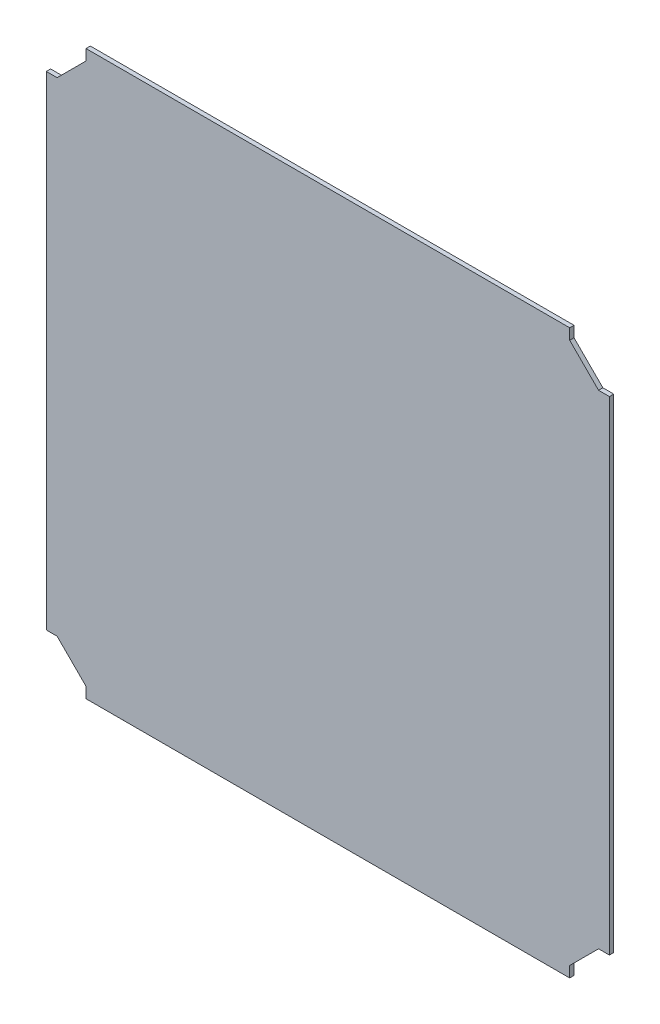
ISO-10303-21;
HEADER;
FILE_DESCRIPTION(('STEP AP214'),'2;1');
FILE_NAME('part.step','',(''),(''),'','','');
FILE_SCHEMA(('AUTOMOTIVE_DESIGN { 1 0 10303 214 1 1 1 1 }'));
ENDSEC;
DATA;
#1=APPLICATION_CONTEXT('core data for automotive mechanical design processes');
#2=APPLICATION_PROTOCOL_DEFINITION('international standard','automotive_design',2000,#1);
#3=PRODUCT_CONTEXT('',#1,'mechanical');
#4=PRODUCT('Part','Part','',(#3));
#5=PRODUCT_RELATED_PRODUCT_CATEGORY('part','',(#4));
#6=PRODUCT_DEFINITION_FORMATION('','',#4);
#7=PRODUCT_DEFINITION_CONTEXT('part definition',#1,'design');
#8=PRODUCT_DEFINITION('design','',#6,#7);
#9=PRODUCT_DEFINITION_SHAPE('','',#8);
#10=(LENGTH_UNIT() NAMED_UNIT(*) SI_UNIT(.MILLI.,.METRE.));
#11=(NAMED_UNIT(*) PLANE_ANGLE_UNIT() SI_UNIT($,.RADIAN.));
#12=(NAMED_UNIT(*) SI_UNIT($,.STERADIAN.) SOLID_ANGLE_UNIT());
#13=UNCERTAINTY_MEASURE_WITH_UNIT(LENGTH_MEASURE(1.E-05),#10,'distance_accuracy_value','');
#14=(GEOMETRIC_REPRESENTATION_CONTEXT(3) GLOBAL_UNCERTAINTY_ASSIGNED_CONTEXT((#13)) GLOBAL_UNIT_ASSIGNED_CONTEXT((#10,
#11,#12)) REPRESENTATION_CONTEXT('',''));
#15=CARTESIAN_POINT('',(0.,0.,0.));
#16=DIRECTION('',(0.,0.,1.));
#17=DIRECTION('',(1.,0.,0.));
#18=AXIS2_PLACEMENT_3D('',#15,#16,#17);
#19=CARTESIAN_POINT('',(-390.,-390.,6.));
#20=DIRECTION('',(1.,0.,0.));
#21=DIRECTION('',(0.,0.,-1.));
#22=AXIS2_PLACEMENT_3D('',#19,#20,#21);
#23=PLANE('',#22);
#24=DIRECTION('',(0.,-1.,0.));
#25=VECTOR('',#24,1.);
#26=CARTESIAN_POINT('',(-390.,-390.,0.));
#27=LINE('',#26,#25);
#28=CARTESIAN_POINT('',(-390.,335.,0.));
#29=VERTEX_POINT('',#28);
#30=CARTESIAN_POINT('',(-390.,-335.,0.));
#31=VERTEX_POINT('',#30);
#32=EDGE_CURVE('E262',#29,#31,#27,.T.);
#33=ORIENTED_EDGE('',*,*,#32,.T.);
#34=DIRECTION('',(0.,0.,1.));
#35=VECTOR('',#34,1.);
#36=CARTESIAN_POINT('',(-390.,-335.,0.));
#37=LINE('',#36,#35);
#38=CARTESIAN_POINT('',(-390.,-335.,6.));
#39=VERTEX_POINT('',#38);
#40=EDGE_CURVE('E230',#31,#39,#37,.T.);
#41=ORIENTED_EDGE('',*,*,#40,.T.);
#42=DIRECTION('',(0.,-1.,0.));
#43=VECTOR('',#42,1.);
#44=CARTESIAN_POINT('',(-390.,-390.,6.));
#45=LINE('',#44,#43);
#46=CARTESIAN_POINT('',(-390.,335.,6.));
#47=VERTEX_POINT('',#46);
#48=EDGE_CURVE('E176',#47,#39,#45,.T.);
#49=ORIENTED_EDGE('',*,*,#48,.F.);
#50=DIRECTION('',(0.,0.,1.));
#51=VECTOR('',#50,1.);
#52=CARTESIAN_POINT('',(-390.,335.,0.));
#53=LINE('',#52,#51);
#54=EDGE_CURVE('E256',#29,#47,#53,.T.);
#55=ORIENTED_EDGE('',*,*,#54,.F.);
#56=EDGE_LOOP('',(#33,#41,#49,#55));
#57=FACE_BOUND('',#56,.T.);
#58=ADVANCED_FACE('F35',(#57),#23,.F.);
#59=CARTESIAN_POINT('',(390.,-390.,6.));
#60=DIRECTION('',(0.,1.,0.));
#61=DIRECTION('',(-1.,0.,0.));
#62=AXIS2_PLACEMENT_3D('',#59,#60,#61);
#63=PLANE('',#62);
#64=DIRECTION('',(1.,0.,0.));
#65=VECTOR('',#64,1.);
#66=CARTESIAN_POINT('',(390.,-390.,6.));
#67=LINE('',#66,#65);
#68=CARTESIAN_POINT('',(-335.,-390.,6.));
#69=VERTEX_POINT('',#68);
#70=CARTESIAN_POINT('',(335.,-390.,6.));
#71=VERTEX_POINT('',#70);
#72=EDGE_CURVE('E180',#69,#71,#67,.T.);
#73=ORIENTED_EDGE('',*,*,#72,.F.);
#74=DIRECTION('',(0.,0.,1.));
#75=VECTOR('',#74,1.);
#76=CARTESIAN_POINT('',(-335.,-390.,0.));
#77=LINE('',#76,#75);
#78=CARTESIAN_POINT('',(-335.,-390.,0.));
#79=VERTEX_POINT('',#78);
#80=EDGE_CURVE('E232',#79,#69,#77,.T.);
#81=ORIENTED_EDGE('',*,*,#80,.F.);
#82=DIRECTION('',(1.,0.,0.));
#83=VECTOR('',#82,1.);
#84=CARTESIAN_POINT('',(390.,-390.,0.));
#85=LINE('',#84,#83);
#86=CARTESIAN_POINT('',(335.,-390.,0.));
#87=VERTEX_POINT('',#86);
#88=EDGE_CURVE('E183',#79,#87,#85,.T.);
#89=ORIENTED_EDGE('',*,*,#88,.T.);
#90=DIRECTION('',(0.,0.,1.));
#91=VECTOR('',#90,1.);
#92=CARTESIAN_POINT('',(335.,-390.,0.));
#93=LINE('',#92,#91);
#94=EDGE_CURVE('E274',#87,#71,#93,.T.);
#95=ORIENTED_EDGE('',*,*,#94,.T.);
#96=EDGE_LOOP('',(#73,#81,#89,#95));
#97=FACE_BOUND('',#96,.T.);
#98=ADVANCED_FACE('F272',(#97),#63,.F.);
#99=CARTESIAN_POINT('',(390.,-390.,6.));
#100=DIRECTION('',(-1.,0.,0.));
#101=DIRECTION('',(0.,0.,1.));
#102=AXIS2_PLACEMENT_3D('',#99,#100,#101);
#103=PLANE('',#102);
#104=DIRECTION('',(0.,1.,0.));
#105=VECTOR('',#104,1.);
#106=CARTESIAN_POINT('',(390.,-390.,6.));
#107=LINE('',#106,#105);
#108=CARTESIAN_POINT('',(390.,-335.,6.));
#109=VERTEX_POINT('',#108);
#110=CARTESIAN_POINT('',(390.,335.,6.));
#111=VERTEX_POINT('',#110);
#112=EDGE_CURVE('E265',#109,#111,#107,.T.);
#113=ORIENTED_EDGE('',*,*,#112,.F.);
#114=DIRECTION('',(0.,0.,1.));
#115=VECTOR('',#114,1.);
#116=CARTESIAN_POINT('',(390.,-335.,0.));
#117=LINE('',#116,#115);
#118=CARTESIAN_POINT('',(390.,-335.,0.));
#119=VERTEX_POINT('',#118);
#120=EDGE_CURVE('E281',#119,#109,#117,.T.);
#121=ORIENTED_EDGE('',*,*,#120,.F.);
#122=DIRECTION('',(0.,1.,0.));
#123=VECTOR('',#122,1.);
#124=CARTESIAN_POINT('',(390.,-390.,0.));
#125=LINE('',#124,#123);
#126=CARTESIAN_POINT('',(390.,335.,0.));
#127=VERTEX_POINT('',#126);
#128=EDGE_CURVE('E177',#119,#127,#125,.T.);
#129=ORIENTED_EDGE('',*,*,#128,.T.);
#130=DIRECTION('',(0.,0.,1.));
#131=VECTOR('',#130,1.);
#132=CARTESIAN_POINT('',(390.,335.,0.));
#133=LINE('',#132,#131);
#134=EDGE_CURVE('E169',#127,#111,#133,.T.);
#135=ORIENTED_EDGE('',*,*,#134,.T.);
#136=EDGE_LOOP('',(#113,#121,#129,#135));
#137=FACE_BOUND('',#136,.T.);
#138=ADVANCED_FACE('F309',(#137),#103,.F.);
#139=CARTESIAN_POINT('',(390.,390.,6.));
#140=DIRECTION('',(0.,-1.,0.));
#141=DIRECTION('',(1.,0.,0.));
#142=AXIS2_PLACEMENT_3D('',#139,#140,#141);
#143=PLANE('',#142);
#144=DIRECTION('',(-1.,0.,0.));
#145=VECTOR('',#144,1.);
#146=CARTESIAN_POINT('',(390.,390.,6.));
#147=LINE('',#146,#145);
#148=CARTESIAN_POINT('',(335.,390.,6.));
#149=VERTEX_POINT('',#148);
#150=CARTESIAN_POINT('',(-335.,390.,6.));
#151=VERTEX_POINT('',#150);
#152=EDGE_CURVE('E168',#149,#151,#147,.T.);
#153=ORIENTED_EDGE('',*,*,#152,.F.);
#154=DIRECTION('',(0.,0.,1.));
#155=VECTOR('',#154,1.);
#156=CARTESIAN_POINT('',(335.,390.,0.));
#157=LINE('',#156,#155);
#158=CARTESIAN_POINT('',(335.,390.,0.));
#159=VERTEX_POINT('',#158);
#160=EDGE_CURVE('E151',#159,#149,#157,.T.);
#161=ORIENTED_EDGE('',*,*,#160,.F.);
#162=DIRECTION('',(-1.,0.,0.));
#163=VECTOR('',#162,1.);
#164=CARTESIAN_POINT('',(390.,390.,0.));
#165=LINE('',#164,#163);
#166=CARTESIAN_POINT('',(-335.,390.,0.));
#167=VERTEX_POINT('',#166);
#168=EDGE_CURVE('E166',#159,#167,#165,.T.);
#169=ORIENTED_EDGE('',*,*,#168,.T.);
#170=DIRECTION('',(0.,0.,1.));
#171=VECTOR('',#170,1.);
#172=CARTESIAN_POINT('',(-335.,390.,0.));
#173=LINE('',#172,#171);
#174=EDGE_CURVE('E260',#167,#151,#173,.T.);
#175=ORIENTED_EDGE('',*,*,#174,.T.);
#176=EDGE_LOOP('',(#153,#161,#169,#175));
#177=FACE_BOUND('',#176,.T.);
#178=ADVANCED_FACE('F164',(#177),#143,.F.);
#179=CARTESIAN_POINT('',(0.,0.,6.));
#180=DIRECTION('',(0.,0.,1.));
#181=DIRECTION('',(1.,0.,0.));
#182=AXIS2_PLACEMENT_3D('',#179,#180,#181);
#183=PLANE('',#182);
#184=DIRECTION('',(-1.,0.,0.));
#185=VECTOR('',#184,1.);
#186=CARTESIAN_POINT('',(-390.,-335.,6.));
#187=LINE('',#186,#185);
#188=CARTESIAN_POINT('',(-375.,-335.,6.));
#189=VERTEX_POINT('',#188);
#190=EDGE_CURVE('E241',#189,#39,#187,.T.);
#191=ORIENTED_EDGE('',*,*,#190,.F.);
#192=DIRECTION('',(-0.707106781186552,0.707106781186543,0.));
#193=VECTOR('',#192,1.);
#194=CARTESIAN_POINT('',(-375.,-335.,6.));
#195=LINE('',#194,#193);
#196=CARTESIAN_POINT('',(-335.,-375.,6.));
#197=VERTEX_POINT('',#196);
#198=EDGE_CURVE('E213',#189,#197,#195,.F.);
#199=ORIENTED_EDGE('',*,*,#198,.T.);
#200=DIRECTION('',(0.,1.,0.));
#201=VECTOR('',#200,1.);
#202=CARTESIAN_POINT('',(-335.,-390.,6.));
#203=LINE('',#202,#201);
#204=EDGE_CURVE('E239',#69,#197,#203,.T.);
#205=ORIENTED_EDGE('',*,*,#204,.F.);
#206=ORIENTED_EDGE('',*,*,#72,.T.);
#207=DIRECTION('',(0.,-1.,0.));
#208=VECTOR('',#207,1.);
#209=CARTESIAN_POINT('',(335.,-390.,6.));
#210=LINE('',#209,#208);
#211=CARTESIAN_POINT('',(335.,-375.,6.));
#212=VERTEX_POINT('',#211);
#213=EDGE_CURVE('E286',#212,#71,#210,.T.);
#214=ORIENTED_EDGE('',*,*,#213,.F.);
#215=DIRECTION('',(-0.707106781186543,-0.707106781186552,0.));
#216=VECTOR('',#215,1.);
#217=CARTESIAN_POINT('',(335.,-375.,6.));
#218=LINE('',#217,#216);
#219=CARTESIAN_POINT('',(375.,-335.,6.));
#220=VERTEX_POINT('',#219);
#221=EDGE_CURVE('E209',#212,#220,#218,.F.);
#222=ORIENTED_EDGE('',*,*,#221,.T.);
#223=DIRECTION('',(-1.,0.,0.));
#224=VECTOR('',#223,1.);
#225=CARTESIAN_POINT('',(390.,-335.,6.));
#226=LINE('',#225,#224);
#227=EDGE_CURVE('E250',#109,#220,#226,.T.);
#228=ORIENTED_EDGE('',*,*,#227,.F.);
#229=ORIENTED_EDGE('',*,*,#112,.T.);
#230=DIRECTION('',(1.,0.,0.));
#231=VECTOR('',#230,1.);
#232=CARTESIAN_POINT('',(390.,335.,6.));
#233=LINE('',#232,#231);
#234=CARTESIAN_POINT('',(375.,335.,6.));
#235=VERTEX_POINT('',#234);
#236=EDGE_CURVE('E159',#235,#111,#233,.T.);
#237=ORIENTED_EDGE('',*,*,#236,.F.);
#238=DIRECTION('',(0.707106781186551,-0.707106781186544,0.));
#239=VECTOR('',#238,1.);
#240=CARTESIAN_POINT('',(375.,335.,6.));
#241=LINE('',#240,#239);
#242=CARTESIAN_POINT('',(335.,375.,6.));
#243=VERTEX_POINT('',#242);
#244=EDGE_CURVE('E205',#235,#243,#241,.F.);
#245=ORIENTED_EDGE('',*,*,#244,.T.);
#246=DIRECTION('',(0.,-1.,0.));
#247=VECTOR('',#246,1.);
#248=CARTESIAN_POINT('',(335.,390.,6.));
#249=LINE('',#248,#247);
#250=EDGE_CURVE('E287',#149,#243,#249,.T.);
#251=ORIENTED_EDGE('',*,*,#250,.F.);
#252=ORIENTED_EDGE('',*,*,#152,.T.);
#253=DIRECTION('',(0.,1.,0.));
#254=VECTOR('',#253,1.);
#255=CARTESIAN_POINT('',(-335.,390.,6.));
#256=LINE('',#255,#254);
#257=CARTESIAN_POINT('',(-335.,375.,6.));
#258=VERTEX_POINT('',#257);
#259=EDGE_CURVE('E254',#258,#151,#256,.T.);
#260=ORIENTED_EDGE('',*,*,#259,.F.);
#261=DIRECTION('',(0.707106781186543,0.707106781186552,0.));
#262=VECTOR('',#261,1.);
#263=CARTESIAN_POINT('',(-335.,375.,6.));
#264=LINE('',#263,#262);
#265=CARTESIAN_POINT('',(-375.,335.,6.));
#266=VERTEX_POINT('',#265);
#267=EDGE_CURVE('E44',#258,#266,#264,.F.);
#268=ORIENTED_EDGE('',*,*,#267,.T.);
#269=DIRECTION('',(1.,0.,0.));
#270=VECTOR('',#269,1.);
#271=CARTESIAN_POINT('',(-390.,335.,6.));
#272=LINE('',#271,#270);
#273=EDGE_CURVE('E257',#47,#266,#272,.T.);
#274=ORIENTED_EDGE('',*,*,#273,.F.);
#275=ORIENTED_EDGE('',*,*,#48,.T.);
#276=EDGE_LOOP('',(#191,#199,#205,#206,#214,#222,#228,#229,#237,#245,#251,#252,#260,#268,#274,#275));
#277=FACE_BOUND('',#276,.T.);
#278=ADVANCED_FACE('F237',(#277),#183,.T.);
#279=CARTESIAN_POINT('',(0.,0.,0.));
#280=DIRECTION('',(0.,0.,1.));
#281=DIRECTION('',(1.,0.,0.));
#282=AXIS2_PLACEMENT_3D('',#279,#280,#281);
#283=PLANE('',#282);
#284=DIRECTION('',(0.,1.,0.));
#285=VECTOR('',#284,1.);
#286=CARTESIAN_POINT('',(-335.,-390.,0.));
#287=LINE('',#286,#285);
#288=CARTESIAN_POINT('',(-335.,-375.,0.));
#289=VERTEX_POINT('',#288);
#290=EDGE_CURVE('E222',#79,#289,#287,.T.);
#291=ORIENTED_EDGE('',*,*,#290,.T.);
#292=DIRECTION('',(0.707106781186552,-0.707106781186543,0.));
#293=VECTOR('',#292,1.);
#294=CARTESIAN_POINT('',(-354.999999999998,-355.000000000002,0.));
#295=LINE('',#294,#293);
#296=CARTESIAN_POINT('',(-375.,-335.,0.));
#297=VERTEX_POINT('',#296);
#298=EDGE_CURVE('E215',#289,#297,#295,.F.);
#299=ORIENTED_EDGE('',*,*,#298,.T.);
#300=DIRECTION('',(-1.,0.,0.));
#301=VECTOR('',#300,1.);
#302=CARTESIAN_POINT('',(-390.,-335.,0.));
#303=LINE('',#302,#301);
#304=EDGE_CURVE('E219',#297,#31,#303,.T.);
#305=ORIENTED_EDGE('',*,*,#304,.T.);
#306=ORIENTED_EDGE('',*,*,#32,.F.);
#307=DIRECTION('',(1.,0.,0.));
#308=VECTOR('',#307,1.);
#309=CARTESIAN_POINT('',(-390.,335.,0.));
#310=LINE('',#309,#308);
#311=CARTESIAN_POINT('',(-375.,335.,0.));
#312=VERTEX_POINT('',#311);
#313=EDGE_CURVE('E252',#29,#312,#310,.T.);
#314=ORIENTED_EDGE('',*,*,#313,.T.);
#315=DIRECTION('',(-0.707106781186543,-0.707106781186552,0.));
#316=VECTOR('',#315,1.);
#317=CARTESIAN_POINT('',(-355.000000000003,354.999999999998,0.));
#318=LINE('',#317,#316);
#319=CARTESIAN_POINT('',(-335.,375.,0.));
#320=VERTEX_POINT('',#319);
#321=EDGE_CURVE('E11',#312,#320,#318,.F.);
#322=ORIENTED_EDGE('',*,*,#321,.T.);
#323=DIRECTION('',(0.,1.,0.));
#324=VECTOR('',#323,1.);
#325=CARTESIAN_POINT('',(-335.,390.,0.));
#326=LINE('',#325,#324);
#327=EDGE_CURVE('E174',#320,#167,#326,.T.);
#328=ORIENTED_EDGE('',*,*,#327,.T.);
#329=ORIENTED_EDGE('',*,*,#168,.F.);
#330=DIRECTION('',(0.,-1.,0.));
#331=VECTOR('',#330,1.);
#332=CARTESIAN_POINT('',(335.,390.,0.));
#333=LINE('',#332,#331);
#334=CARTESIAN_POINT('',(335.,375.,0.));
#335=VERTEX_POINT('',#334);
#336=EDGE_CURVE('E147',#159,#335,#333,.T.);
#337=ORIENTED_EDGE('',*,*,#336,.T.);
#338=DIRECTION('',(-0.707106781186551,0.707106781186544,0.));
#339=VECTOR('',#338,1.);
#340=CARTESIAN_POINT('',(354.999999999998,355.000000000002,0.));
#341=LINE('',#340,#339);
#342=CARTESIAN_POINT('',(375.,335.,0.));
#343=VERTEX_POINT('',#342);
#344=EDGE_CURVE('E207',#335,#343,#341,.F.);
#345=ORIENTED_EDGE('',*,*,#344,.T.);
#346=DIRECTION('',(1.,0.,0.));
#347=VECTOR('',#346,1.);
#348=CARTESIAN_POINT('',(390.,335.,0.));
#349=LINE('',#348,#347);
#350=EDGE_CURVE('E158',#343,#127,#349,.T.);
#351=ORIENTED_EDGE('',*,*,#350,.T.);
#352=ORIENTED_EDGE('',*,*,#128,.F.);
#353=DIRECTION('',(-1.,0.,0.));
#354=VECTOR('',#353,1.);
#355=CARTESIAN_POINT('',(390.,-335.,0.));
#356=LINE('',#355,#354);
#357=CARTESIAN_POINT('',(375.,-335.,0.));
#358=VERTEX_POINT('',#357);
#359=EDGE_CURVE('E282',#119,#358,#356,.T.);
#360=ORIENTED_EDGE('',*,*,#359,.T.);
#361=DIRECTION('',(0.707106781186543,0.707106781186552,0.));
#362=VECTOR('',#361,1.);
#363=CARTESIAN_POINT('',(355.000000000002,-354.999999999998,0.));
#364=LINE('',#363,#362);
#365=CARTESIAN_POINT('',(335.,-375.,0.));
#366=VERTEX_POINT('',#365);
#367=EDGE_CURVE('E211',#358,#366,#364,.F.);
#368=ORIENTED_EDGE('',*,*,#367,.T.);
#369=DIRECTION('',(0.,-1.,0.));
#370=VECTOR('',#369,1.);
#371=CARTESIAN_POINT('',(335.,-390.,0.));
#372=LINE('',#371,#370);
#373=EDGE_CURVE('E276',#366,#87,#372,.T.);
#374=ORIENTED_EDGE('',*,*,#373,.T.);
#375=ORIENTED_EDGE('',*,*,#88,.F.);
#376=EDGE_LOOP('',(#291,#299,#305,#306,#314,#322,#328,#329,#337,#345,#351,#352,#360,#368,#374,#375));
#377=FACE_BOUND('',#376,.T.);
#378=ADVANCED_FACE('F172',(#377),#283,.F.);
#379=CARTESIAN_POINT('',(-335.,390.,0.));
#380=DIRECTION('',(1.,0.,0.));
#381=DIRECTION('',(0.,0.,-1.));
#382=AXIS2_PLACEMENT_3D('',#379,#380,#381);
#383=PLANE('',#382);
#384=ORIENTED_EDGE('',*,*,#327,.F.);
#385=DIRECTION('',(0.,0.,1.));
#386=VECTOR('',#385,1.);
#387=CARTESIAN_POINT('',(-335.,375.,6.));
#388=LINE('',#387,#386);
#389=EDGE_CURVE('E201',#320,#258,#388,.T.);
#390=ORIENTED_EDGE('',*,*,#389,.T.);
#391=ORIENTED_EDGE('',*,*,#259,.T.);
#392=ORIENTED_EDGE('',*,*,#174,.F.);
#393=EDGE_LOOP('',(#384,#390,#391,#392));
#394=FACE_BOUND('',#393,.T.);
#395=ADVANCED_FACE('F350',(#394),#383,.F.);
#396=CARTESIAN_POINT('',(-390.,335.,0.));
#397=DIRECTION('',(0.,-1.,0.));
#398=DIRECTION('',(0.,0.,-1.));
#399=AXIS2_PLACEMENT_3D('',#396,#397,#398);
#400=PLANE('',#399);
#401=ORIENTED_EDGE('',*,*,#273,.T.);
#402=DIRECTION('',(0.,0.,-1.));
#403=VECTOR('',#402,1.);
#404=CARTESIAN_POINT('',(-375.,335.,0.));
#405=LINE('',#404,#403);
#406=EDGE_CURVE('E51',#266,#312,#405,.T.);
#407=ORIENTED_EDGE('',*,*,#406,.T.);
#408=ORIENTED_EDGE('',*,*,#313,.F.);
#409=ORIENTED_EDGE('',*,*,#54,.T.);
#410=EDGE_LOOP('',(#401,#407,#408,#409));
#411=FACE_BOUND('',#410,.T.);
#412=ADVANCED_FACE('F353',(#411),#400,.F.);
#413=CARTESIAN_POINT('',(390.,335.,0.));
#414=DIRECTION('',(0.,-1.,0.));
#415=DIRECTION('',(0.,0.,-1.));
#416=AXIS2_PLACEMENT_3D('',#413,#414,#415);
#417=PLANE('',#416);
#418=ORIENTED_EDGE('',*,*,#350,.F.);
#419=DIRECTION('',(0.,0.,1.));
#420=VECTOR('',#419,1.);
#421=CARTESIAN_POINT('',(375.,335.,6.));
#422=LINE('',#421,#420);
#423=EDGE_CURVE('E187',#343,#235,#422,.T.);
#424=ORIENTED_EDGE('',*,*,#423,.T.);
#425=ORIENTED_EDGE('',*,*,#236,.T.);
#426=ORIENTED_EDGE('',*,*,#134,.F.);
#427=EDGE_LOOP('',(#418,#424,#425,#426));
#428=FACE_BOUND('',#427,.T.);
#429=ADVANCED_FACE('F304',(#428),#417,.F.);
#430=CARTESIAN_POINT('',(335.,390.,0.));
#431=DIRECTION('',(-1.,0.,0.));
#432=DIRECTION('',(0.,0.,1.));
#433=AXIS2_PLACEMENT_3D('',#430,#431,#432);
#434=PLANE('',#433);
#435=ORIENTED_EDGE('',*,*,#250,.T.);
#436=DIRECTION('',(0.,0.,-1.));
#437=VECTOR('',#436,1.);
#438=CARTESIAN_POINT('',(335.,375.,0.));
#439=LINE('',#438,#437);
#440=EDGE_CURVE('E154',#243,#335,#439,.T.);
#441=ORIENTED_EDGE('',*,*,#440,.T.);
#442=ORIENTED_EDGE('',*,*,#336,.F.);
#443=ORIENTED_EDGE('',*,*,#160,.T.);
#444=EDGE_LOOP('',(#435,#441,#442,#443));
#445=FACE_BOUND('',#444,.T.);
#446=ADVANCED_FACE('F150',(#445),#434,.F.);
#447=CARTESIAN_POINT('',(335.,-390.,0.));
#448=DIRECTION('',(-1.,0.,0.));
#449=DIRECTION('',(0.,0.,1.));
#450=AXIS2_PLACEMENT_3D('',#447,#448,#449);
#451=PLANE('',#450);
#452=ORIENTED_EDGE('',*,*,#373,.F.);
#453=DIRECTION('',(0.,0.,1.));
#454=VECTOR('',#453,1.);
#455=CARTESIAN_POINT('',(335.,-375.,6.));
#456=LINE('',#455,#454);
#457=EDGE_CURVE('E191',#366,#212,#456,.T.);
#458=ORIENTED_EDGE('',*,*,#457,.T.);
#459=ORIENTED_EDGE('',*,*,#213,.T.);
#460=ORIENTED_EDGE('',*,*,#94,.F.);
#461=EDGE_LOOP('',(#452,#458,#459,#460));
#462=FACE_BOUND('',#461,.T.);
#463=ADVANCED_FACE('F284',(#462),#451,.F.);
#464=CARTESIAN_POINT('',(390.,-335.,0.));
#465=DIRECTION('',(0.,1.,0.));
#466=DIRECTION('',(0.,0.,1.));
#467=AXIS2_PLACEMENT_3D('',#464,#465,#466);
#468=PLANE('',#467);
#469=ORIENTED_EDGE('',*,*,#227,.T.);
#470=DIRECTION('',(0.,0.,-1.));
#471=VECTOR('',#470,1.);
#472=CARTESIAN_POINT('',(375.,-335.,0.));
#473=LINE('',#472,#471);
#474=EDGE_CURVE('E194',#220,#358,#473,.T.);
#475=ORIENTED_EDGE('',*,*,#474,.T.);
#476=ORIENTED_EDGE('',*,*,#359,.F.);
#477=ORIENTED_EDGE('',*,*,#120,.T.);
#478=EDGE_LOOP('',(#469,#475,#476,#477));
#479=FACE_BOUND('',#478,.T.);
#480=ADVANCED_FACE('F312',(#479),#468,.F.);
#481=CARTESIAN_POINT('',(-390.,-335.,0.));
#482=DIRECTION('',(0.,1.,0.));
#483=DIRECTION('',(-1.,0.,0.));
#484=AXIS2_PLACEMENT_3D('',#481,#482,#483);
#485=PLANE('',#484);
#486=ORIENTED_EDGE('',*,*,#304,.F.);
#487=DIRECTION('',(0.,0.,1.));
#488=VECTOR('',#487,1.);
#489=CARTESIAN_POINT('',(-375.,-335.,6.));
#490=LINE('',#489,#488);
#491=EDGE_CURVE('E196',#297,#189,#490,.T.);
#492=ORIENTED_EDGE('',*,*,#491,.T.);
#493=ORIENTED_EDGE('',*,*,#190,.T.);
#494=ORIENTED_EDGE('',*,*,#40,.F.);
#495=EDGE_LOOP('',(#486,#492,#493,#494));
#496=FACE_BOUND('',#495,.T.);
#497=ADVANCED_FACE('F227',(#496),#485,.F.);
#498=CARTESIAN_POINT('',(-335.,-390.,0.));
#499=DIRECTION('',(1.,0.,0.));
#500=DIRECTION('',(0.,0.,-1.));
#501=AXIS2_PLACEMENT_3D('',#498,#499,#500);
#502=PLANE('',#501);
#503=ORIENTED_EDGE('',*,*,#204,.T.);
#504=DIRECTION('',(0.,0.,-1.));
#505=VECTOR('',#504,1.);
#506=CARTESIAN_POINT('',(-335.,-375.,0.));
#507=LINE('',#506,#505);
#508=EDGE_CURVE('E199',#197,#289,#507,.T.);
#509=ORIENTED_EDGE('',*,*,#508,.T.);
#510=ORIENTED_EDGE('',*,*,#290,.F.);
#511=ORIENTED_EDGE('',*,*,#80,.T.);
#512=EDGE_LOOP('',(#503,#509,#510,#511));
#513=FACE_BOUND('',#512,.T.);
#514=ADVANCED_FACE('F243',(#513),#502,.F.);
#515=CARTESIAN_POINT('',(375.,335.,0.));
#516=DIRECTION('',(0.707106781186543,0.707106781186551,0.));
#517=DIRECTION('',(0.,0.,-1.));
#518=AXIS2_PLACEMENT_3D('',#515,#516,#517);
#519=PLANE('',#518);
#520=ORIENTED_EDGE('',*,*,#344,.F.);
#521=ORIENTED_EDGE('',*,*,#440,.F.);
#522=ORIENTED_EDGE('',*,*,#244,.F.);
#523=ORIENTED_EDGE('',*,*,#423,.F.);
#524=EDGE_LOOP('',(#520,#521,#522,#523));
#525=FACE_BOUND('',#524,.T.);
#526=ADVANCED_FACE('F317',(#525),#519,.T.);
#527=CARTESIAN_POINT('',(335.,-375.,0.));
#528=DIRECTION('',(0.707106781186552,-0.707106781186543,0.));
#529=DIRECTION('',(0.,0.,-1.));
#530=AXIS2_PLACEMENT_3D('',#527,#528,#529);
#531=PLANE('',#530);
#532=ORIENTED_EDGE('',*,*,#367,.F.);
#533=ORIENTED_EDGE('',*,*,#474,.F.);
#534=ORIENTED_EDGE('',*,*,#221,.F.);
#535=ORIENTED_EDGE('',*,*,#457,.F.);
#536=EDGE_LOOP('',(#532,#533,#534,#535));
#537=FACE_BOUND('',#536,.T.);
#538=ADVANCED_FACE('F315',(#537),#531,.T.);
#539=CARTESIAN_POINT('',(-375.,-335.,0.));
#540=DIRECTION('',(-0.707106781186543,-0.707106781186552,0.));
#541=DIRECTION('',(0.,0.,-1.));
#542=AXIS2_PLACEMENT_3D('',#539,#540,#541);
#543=PLANE('',#542);
#544=ORIENTED_EDGE('',*,*,#298,.F.);
#545=ORIENTED_EDGE('',*,*,#508,.F.);
#546=ORIENTED_EDGE('',*,*,#198,.F.);
#547=ORIENTED_EDGE('',*,*,#491,.F.);
#548=EDGE_LOOP('',(#544,#545,#546,#547));
#549=FACE_BOUND('',#548,.T.);
#550=ADVANCED_FACE('F234',(#549),#543,.T.);
#551=CARTESIAN_POINT('',(-335.,375.,0.));
#552=DIRECTION('',(-0.707106781186552,0.707106781186543,0.));
#553=DIRECTION('',(0.,0.,-1.));
#554=AXIS2_PLACEMENT_3D('',#551,#552,#553);
#555=PLANE('',#554);
#556=ORIENTED_EDGE('',*,*,#321,.F.);
#557=ORIENTED_EDGE('',*,*,#406,.F.);
#558=ORIENTED_EDGE('',*,*,#267,.F.);
#559=ORIENTED_EDGE('',*,*,#389,.F.);
#560=EDGE_LOOP('',(#556,#557,#558,#559));
#561=FACE_BOUND('',#560,.T.);
#562=ADVANCED_FACE('F38',(#561),#555,.T.);
#563=CLOSED_SHELL('',(#58,#98,#138,#178,#278,#378,#395,#412,#429,#446,#463,#480,#497,#514,#526,
#538,#550,#562));
#564=MANIFOLD_SOLID_BREP('B2',#563);
#565=ADVANCED_BREP_SHAPE_REPRESENTATION('',(#18,#564),#14);
#566=SHAPE_DEFINITION_REPRESENTATION(#9,#565);
ENDSEC;
END-ISO-10303-21;
